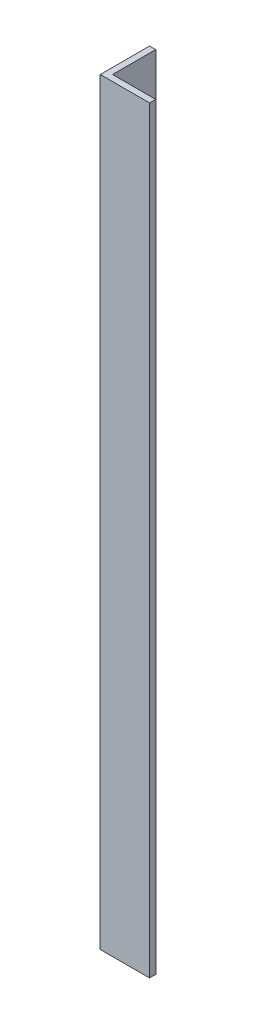
ISO-10303-21;
HEADER;
FILE_DESCRIPTION(('STEP AP214'),'2;1');
FILE_NAME('part.step','',(''),(''),'','','');
FILE_SCHEMA(('AUTOMOTIVE_DESIGN { 1 0 10303 214 1 1 1 1 }'));
ENDSEC;
DATA;
#1=APPLICATION_CONTEXT('core data for automotive mechanical design processes');
#2=APPLICATION_PROTOCOL_DEFINITION('international standard','automotive_design',2000,#1);
#3=PRODUCT_CONTEXT('',#1,'mechanical');
#4=PRODUCT('Part','Part','',(#3));
#5=PRODUCT_RELATED_PRODUCT_CATEGORY('part','',(#4));
#6=PRODUCT_DEFINITION_FORMATION('','',#4);
#7=PRODUCT_DEFINITION_CONTEXT('part definition',#1,'design');
#8=PRODUCT_DEFINITION('design','',#6,#7);
#9=PRODUCT_DEFINITION_SHAPE('','',#8);
#10=(LENGTH_UNIT() NAMED_UNIT(*) SI_UNIT(.MILLI.,.METRE.));
#11=(NAMED_UNIT(*) PLANE_ANGLE_UNIT() SI_UNIT($,.RADIAN.));
#12=(NAMED_UNIT(*) SI_UNIT($,.STERADIAN.) SOLID_ANGLE_UNIT());
#13=UNCERTAINTY_MEASURE_WITH_UNIT(LENGTH_MEASURE(1.E-05),#10,'distance_accuracy_value','');
#14=(GEOMETRIC_REPRESENTATION_CONTEXT(3) GLOBAL_UNCERTAINTY_ASSIGNED_CONTEXT((#13)) GLOBAL_UNIT_ASSIGNED_CONTEXT((#10,
#11,#12)) REPRESENTATION_CONTEXT('',''));
#15=CARTESIAN_POINT('',(0.,0.,0.));
#16=DIRECTION('',(0.,0.,1.));
#17=DIRECTION('',(1.,0.,0.));
#18=AXIS2_PLACEMENT_3D('',#15,#16,#17);
#19=CARTESIAN_POINT('',(76.2,1170.475,0.));
#20=DIRECTION('',(1.,0.,0.));
#21=DIRECTION('',(0.,0.,-1.));
#22=AXIS2_PLACEMENT_3D('',#19,#20,#21);
#23=PLANE('',#22);
#24=DIRECTION('',(0.,0.,1.));
#25=VECTOR('',#24,1.);
#26=CARTESIAN_POINT('',(76.2,0.,0.));
#27=LINE('',#26,#25);
#28=CARTESIAN_POINT('',(76.2,0.,-9.525));
#29=VERTEX_POINT('',#28);
#30=CARTESIAN_POINT('',(76.2,0.,0.));
#31=VERTEX_POINT('',#30);
#32=EDGE_CURVE('E120',#29,#31,#27,.T.);
#33=ORIENTED_EDGE('',*,*,#32,.F.);
#34=DIRECTION('',(0.,-1.,0.));
#35=VECTOR('',#34,1.);
#36=CARTESIAN_POINT('',(76.2,1170.475,-9.525));
#37=LINE('',#36,#35);
#38=CARTESIAN_POINT('',(76.2,1170.475,-9.525));
#39=VERTEX_POINT('',#38);
#40=EDGE_CURVE('E11',#39,#29,#37,.T.);
#41=ORIENTED_EDGE('',*,*,#40,.F.);
#42=DIRECTION('',(0.,0.,1.));
#43=VECTOR('',#42,1.);
#44=CARTESIAN_POINT('',(76.2,1170.475,0.));
#45=LINE('',#44,#43);
#46=CARTESIAN_POINT('',(76.2,1170.475,0.));
#47=VERTEX_POINT('',#46);
#48=EDGE_CURVE('E134',#39,#47,#45,.T.);
#49=ORIENTED_EDGE('',*,*,#48,.T.);
#50=DIRECTION('',(0.,-1.,0.));
#51=VECTOR('',#50,1.);
#52=CARTESIAN_POINT('',(76.2,1170.475,0.));
#53=LINE('',#52,#51);
#54=EDGE_CURVE('E83',#47,#31,#53,.T.);
#55=ORIENTED_EDGE('',*,*,#54,.T.);
#56=EDGE_LOOP('',(#33,#41,#49,#55));
#57=FACE_BOUND('',#56,.T.);
#58=ADVANCED_FACE('F39',(#57),#23,.T.);
#59=CARTESIAN_POINT('',(0.,1170.475,-9.525));
#60=DIRECTION('',(0.,0.,-1.));
#61=DIRECTION('',(-1.,0.,0.));
#62=AXIS2_PLACEMENT_3D('',#59,#60,#61);
#63=PLANE('',#62);
#64=DIRECTION('',(1.,0.,0.));
#65=VECTOR('',#64,1.);
#66=CARTESIAN_POINT('',(0.,0.,-9.525));
#67=LINE('',#66,#65);
#68=CARTESIAN_POINT('',(9.525,0.,-9.525));
#69=VERTEX_POINT('',#68);
#70=EDGE_CURVE('E123',#69,#29,#67,.T.);
#71=ORIENTED_EDGE('',*,*,#70,.F.);
#72=DIRECTION('',(0.,-1.,0.));
#73=VECTOR('',#72,1.);
#74=CARTESIAN_POINT('',(9.525,1170.475,-9.525));
#75=LINE('',#74,#73);
#76=CARTESIAN_POINT('',(9.525,1170.475,-9.525));
#77=VERTEX_POINT('',#76);
#78=EDGE_CURVE('E47',#77,#69,#75,.T.);
#79=ORIENTED_EDGE('',*,*,#78,.F.);
#80=DIRECTION('',(1.,0.,0.));
#81=VECTOR('',#80,1.);
#82=CARTESIAN_POINT('',(0.,1170.475,-9.525));
#83=LINE('',#82,#81);
#84=EDGE_CURVE('E146',#77,#39,#83,.T.);
#85=ORIENTED_EDGE('',*,*,#84,.T.);
#86=ORIENTED_EDGE('',*,*,#40,.T.);
#87=EDGE_LOOP('',(#71,#79,#85,#86));
#88=FACE_BOUND('',#87,.T.);
#89=ADVANCED_FACE('F145',(#88),#63,.T.);
#90=CARTESIAN_POINT('',(9.525,1170.475,0.));
#91=DIRECTION('',(-1.,0.,0.));
#92=DIRECTION('',(0.,0.,1.));
#93=AXIS2_PLACEMENT_3D('',#90,#91,#92);
#94=PLANE('',#93);
#95=DIRECTION('',(0.,0.,-1.));
#96=VECTOR('',#95,1.);
#97=CARTESIAN_POINT('',(9.525,0.,0.));
#98=LINE('',#97,#96);
#99=CARTESIAN_POINT('',(9.525,0.,-76.2));
#100=VERTEX_POINT('',#99);
#101=EDGE_CURVE('E126',#69,#100,#98,.T.);
#102=ORIENTED_EDGE('',*,*,#101,.T.);
#103=DIRECTION('',(0.,-1.,0.));
#104=VECTOR('',#103,1.);
#105=CARTESIAN_POINT('',(9.525,1170.475,-76.2));
#106=LINE('',#105,#104);
#107=CARTESIAN_POINT('',(9.525,1170.475,-76.2));
#108=VERTEX_POINT('',#107);
#109=EDGE_CURVE('E106',#108,#100,#106,.T.);
#110=ORIENTED_EDGE('',*,*,#109,.F.);
#111=DIRECTION('',(0.,0.,-1.));
#112=VECTOR('',#111,1.);
#113=CARTESIAN_POINT('',(9.525,1170.475,0.));
#114=LINE('',#113,#112);
#115=EDGE_CURVE('E112',#77,#108,#114,.T.);
#116=ORIENTED_EDGE('',*,*,#115,.F.);
#117=ORIENTED_EDGE('',*,*,#78,.T.);
#118=EDGE_LOOP('',(#102,#110,#116,#117));
#119=FACE_BOUND('',#118,.T.);
#120=ADVANCED_FACE('F139',(#119),#94,.F.);
#121=CARTESIAN_POINT('',(0.,1170.475,-76.2));
#122=DIRECTION('',(0.,0.,-1.));
#123=DIRECTION('',(-1.,0.,0.));
#124=AXIS2_PLACEMENT_3D('',#121,#122,#123);
#125=PLANE('',#124);
#126=DIRECTION('',(1.,0.,0.));
#127=VECTOR('',#126,1.);
#128=CARTESIAN_POINT('',(0.,0.,-76.2));
#129=LINE('',#128,#127);
#130=CARTESIAN_POINT('',(0.,0.,-76.2));
#131=VERTEX_POINT('',#130);
#132=EDGE_CURVE('E101',#131,#100,#129,.T.);
#133=ORIENTED_EDGE('',*,*,#132,.F.);
#134=DIRECTION('',(0.,-1.,0.));
#135=VECTOR('',#134,1.);
#136=CARTESIAN_POINT('',(0.,1170.475,-76.2));
#137=LINE('',#136,#135);
#138=CARTESIAN_POINT('',(0.,1170.475,-76.2));
#139=VERTEX_POINT('',#138);
#140=EDGE_CURVE('E96',#139,#131,#137,.T.);
#141=ORIENTED_EDGE('',*,*,#140,.F.);
#142=DIRECTION('',(1.,0.,0.));
#143=VECTOR('',#142,1.);
#144=CARTESIAN_POINT('',(0.,1170.475,-76.2));
#145=LINE('',#144,#143);
#146=EDGE_CURVE('E99',#139,#108,#145,.T.);
#147=ORIENTED_EDGE('',*,*,#146,.T.);
#148=ORIENTED_EDGE('',*,*,#109,.T.);
#149=EDGE_LOOP('',(#133,#141,#147,#148));
#150=FACE_BOUND('',#149,.T.);
#151=ADVANCED_FACE('F98',(#150),#125,.T.);
#152=CARTESIAN_POINT('',(0.,1170.475,0.));
#153=DIRECTION('',(-1.,0.,0.));
#154=DIRECTION('',(0.,0.,1.));
#155=AXIS2_PLACEMENT_3D('',#152,#153,#154);
#156=PLANE('',#155);
#157=DIRECTION('',(0.,0.,-1.));
#158=VECTOR('',#157,1.);
#159=CARTESIAN_POINT('',(0.,0.,0.));
#160=LINE('',#159,#158);
#161=CARTESIAN_POINT('',(0.,0.,0.));
#162=VERTEX_POINT('',#161);
#163=EDGE_CURVE('E130',#162,#131,#160,.T.);
#164=ORIENTED_EDGE('',*,*,#163,.F.);
#165=DIRECTION('',(0.,-1.,0.));
#166=VECTOR('',#165,1.);
#167=CARTESIAN_POINT('',(0.,1170.475,0.));
#168=LINE('',#167,#166);
#169=CARTESIAN_POINT('',(0.,1170.475,0.));
#170=VERTEX_POINT('',#169);
#171=EDGE_CURVE('E76',#170,#162,#168,.T.);
#172=ORIENTED_EDGE('',*,*,#171,.F.);
#173=DIRECTION('',(0.,0.,-1.));
#174=VECTOR('',#173,1.);
#175=CARTESIAN_POINT('',(0.,1170.475,0.));
#176=LINE('',#175,#174);
#177=EDGE_CURVE('E109',#170,#139,#176,.T.);
#178=ORIENTED_EDGE('',*,*,#177,.T.);
#179=ORIENTED_EDGE('',*,*,#140,.T.);
#180=EDGE_LOOP('',(#164,#172,#178,#179));
#181=FACE_BOUND('',#180,.T.);
#182=ADVANCED_FACE('F115',(#181),#156,.T.);
#183=CARTESIAN_POINT('',(0.,1170.475,0.));
#184=DIRECTION('',(0.,0.,-1.));
#185=DIRECTION('',(-1.,0.,0.));
#186=AXIS2_PLACEMENT_3D('',#183,#184,#185);
#187=PLANE('',#186);
#188=DIRECTION('',(1.,0.,0.));
#189=VECTOR('',#188,1.);
#190=CARTESIAN_POINT('',(0.,0.,0.));
#191=LINE('',#190,#189);
#192=EDGE_CURVE('E132',#162,#31,#191,.T.);
#193=ORIENTED_EDGE('',*,*,#192,.T.);
#194=ORIENTED_EDGE('',*,*,#54,.F.);
#195=DIRECTION('',(1.,0.,0.));
#196=VECTOR('',#195,1.);
#197=CARTESIAN_POINT('',(0.,1170.475,0.));
#198=LINE('',#197,#196);
#199=EDGE_CURVE('E55',#170,#47,#198,.T.);
#200=ORIENTED_EDGE('',*,*,#199,.F.);
#201=ORIENTED_EDGE('',*,*,#171,.T.);
#202=EDGE_LOOP('',(#193,#194,#200,#201));
#203=FACE_BOUND('',#202,.T.);
#204=ADVANCED_FACE('F147',(#203),#187,.F.);
#205=CARTESIAN_POINT('',(0.,1170.475,0.));
#206=DIRECTION('',(0.,1.,0.));
#207=DIRECTION('',(0.,0.,1.));
#208=AXIS2_PLACEMENT_3D('',#205,#206,#207);
#209=PLANE('',#208);
#210=ORIENTED_EDGE('',*,*,#48,.F.);
#211=ORIENTED_EDGE('',*,*,#84,.F.);
#212=ORIENTED_EDGE('',*,*,#115,.T.);
#213=ORIENTED_EDGE('',*,*,#146,.F.);
#214=ORIENTED_EDGE('',*,*,#177,.F.);
#215=ORIENTED_EDGE('',*,*,#199,.T.);
#216=EDGE_LOOP('',(#210,#211,#212,#213,#214,#215));
#217=FACE_BOUND('',#216,.T.);
#218=ADVANCED_FACE('F108',(#217),#209,.T.);
#219=CARTESIAN_POINT('',(0.,0.,0.));
#220=DIRECTION('',(0.,1.,0.));
#221=DIRECTION('',(0.,0.,1.));
#222=AXIS2_PLACEMENT_3D('',#219,#220,#221);
#223=PLANE('',#222);
#224=ORIENTED_EDGE('',*,*,#32,.T.);
#225=ORIENTED_EDGE('',*,*,#192,.F.);
#226=ORIENTED_EDGE('',*,*,#163,.T.);
#227=ORIENTED_EDGE('',*,*,#132,.T.);
#228=ORIENTED_EDGE('',*,*,#101,.F.);
#229=ORIENTED_EDGE('',*,*,#70,.T.);
#230=EDGE_LOOP('',(#224,#225,#226,#227,#228,#229));
#231=FACE_BOUND('',#230,.T.);
#232=ADVANCED_FACE('F144',(#231),#223,.F.);
#233=CLOSED_SHELL('',(#58,#89,#120,#151,#182,#204,#218,#232));
#234=MANIFOLD_SOLID_BREP('B2',#233);
#235=ADVANCED_BREP_SHAPE_REPRESENTATION('',(#18,#234),#14);
#236=SHAPE_DEFINITION_REPRESENTATION(#9,#235);
ENDSEC;
END-ISO-10303-21;
